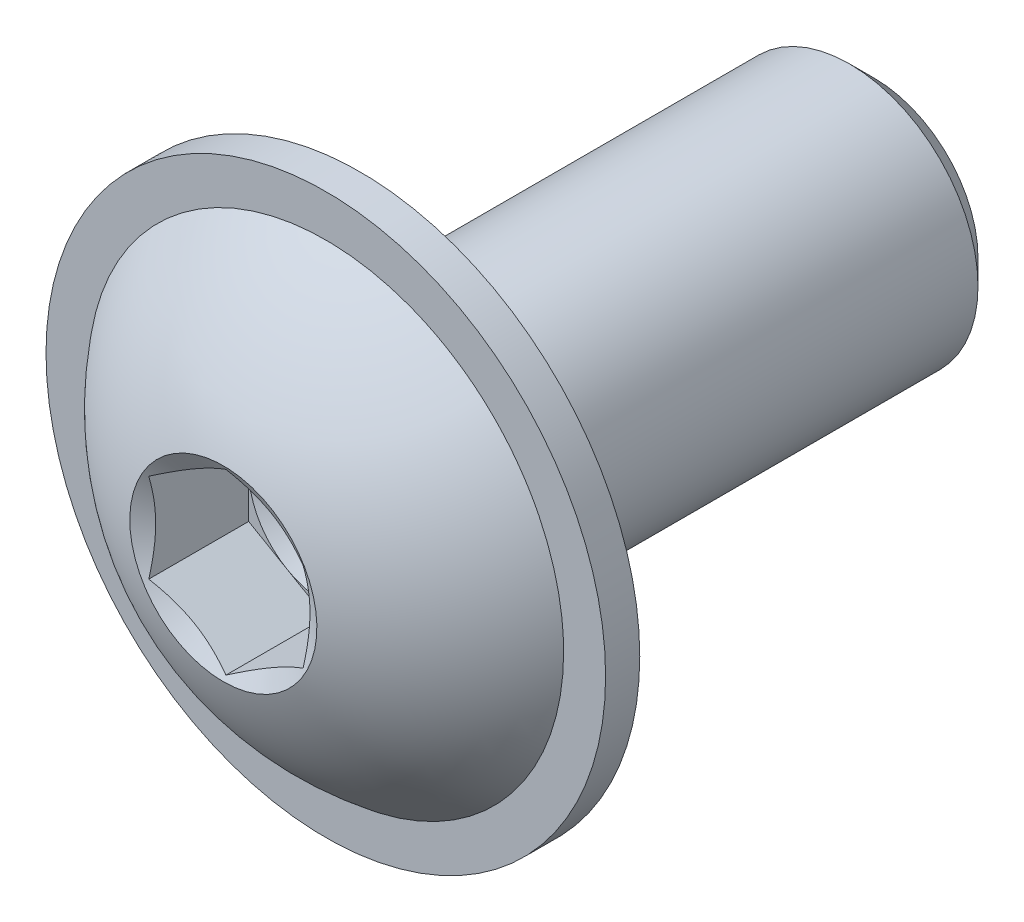
ISO-10303-21;
HEADER;
FILE_DESCRIPTION(('STEP AP214'),'2;1');
FILE_NAME('part.step','',(''),(''),'','','');
FILE_SCHEMA(('AUTOMOTIVE_DESIGN { 1 0 10303 214 1 1 1 1 }'));
ENDSEC;
DATA;
#1=APPLICATION_CONTEXT('core data for automotive mechanical design processes');
#2=APPLICATION_PROTOCOL_DEFINITION('international standard','automotive_design',2000,#1);
#3=PRODUCT_CONTEXT('',#1,'mechanical');
#4=PRODUCT('Part','Part','',(#3));
#5=PRODUCT_RELATED_PRODUCT_CATEGORY('part','',(#4));
#6=PRODUCT_DEFINITION_FORMATION('','',#4);
#7=PRODUCT_DEFINITION_CONTEXT('part definition',#1,'design');
#8=PRODUCT_DEFINITION('design','',#6,#7);
#9=PRODUCT_DEFINITION_SHAPE('','',#8);
#10=(LENGTH_UNIT() NAMED_UNIT(*) SI_UNIT(.MILLI.,.METRE.));
#11=(NAMED_UNIT(*) PLANE_ANGLE_UNIT() SI_UNIT($,.RADIAN.));
#12=(NAMED_UNIT(*) SI_UNIT($,.STERADIAN.) SOLID_ANGLE_UNIT());
#13=UNCERTAINTY_MEASURE_WITH_UNIT(LENGTH_MEASURE(1.E-05),#10,'distance_accuracy_value','');
#14=(GEOMETRIC_REPRESENTATION_CONTEXT(3) GLOBAL_UNCERTAINTY_ASSIGNED_CONTEXT((#13)) GLOBAL_UNIT_ASSIGNED_CONTEXT((#10,
#11,#12)) REPRESENTATION_CONTEXT('',''));
#15=CARTESIAN_POINT('',(0.,0.,0.));
#16=DIRECTION('',(0.,0.,1.));
#17=DIRECTION('',(1.,0.,0.));
#18=AXIS2_PLACEMENT_3D('',#15,#16,#17);
#19=CARTESIAN_POINT('',(2.38125,1.3748153285078,8.9916));
#20=DIRECTION('',(0.,0.,-1.));
#21=DIRECTION('',(-1.,0.,0.));
#22=AXIS2_PLACEMENT_3D('',#19,#20,#21);
#23=PLANE('',#22);
#24=CARTESIAN_POINT('',(0.,0.,8.99160000000165));
#25=DIRECTION('',(0.,0.,1.));
#26=DIRECTION('',(1.,0.,0.));
#27=AXIS2_PLACEMENT_3D('',#24,#25,#26);
#28=CIRCLE('',#27,2.3812499999849);
#29=CARTESIAN_POINT('',(-2.3812499999729,0.,8.99160000000083));
#30=VERTEX_POINT('',#29);
#31=CARTESIAN_POINT('',(-1.19062499640266,2.06222299484195,8.99160000000165));
#32=VERTEX_POINT('',#31);
#33=EDGE_CURVE('E20',#30,#32,#28,.F.);
#34=ORIENTED_EDGE('',*,*,#33,.T.);
#35=DIRECTION('',(0.86602540552574,0.499999996983977,0.));
#36=VECTOR('',#35,1.);
#37=CARTESIAN_POINT('',(-2.38124999759656,1.37481533544816,8.9916));
#38=LINE('',#37,#36);
#39=CARTESIAN_POINT('',(-2.38124999996403,1.37481534275786,8.99160000000374));
#40=VERTEX_POINT('',#39);
#41=EDGE_CURVE('E119',#40,#32,#38,.T.);
#42=ORIENTED_EDGE('',*,*,#41,.F.);
#43=DIRECTION('',(0.,1.,0.));
#44=VECTOR('',#43,1.);
#45=CARTESIAN_POINT('',(-2.38124999994604,1.3748153285078,8.9916));
#46=LINE('',#45,#44);
#47=EDGE_CURVE('E102',#30,#40,#46,.T.);
#48=ORIENTED_EDGE('',*,*,#47,.F.);
#49=EDGE_LOOP('',(#34,#42,#48));
#50=FACE_BOUND('',#49,.T.);
#51=ADVANCED_FACE('F16',(#50),#23,.F.);
#52=CARTESIAN_POINT('',(2.38125,1.3748153285078,8.9916));
#53=DIRECTION('',(0.,0.,-1.));
#54=DIRECTION('',(-1.,0.,0.));
#55=AXIS2_PLACEMENT_3D('',#52,#53,#54);
#56=PLANE('',#55);
#57=CARTESIAN_POINT('',(0.,0.,8.99160000000165));
#58=DIRECTION('',(0.,0.,1.));
#59=DIRECTION('',(1.,0.,0.));
#60=AXIS2_PLACEMENT_3D('',#57,#58,#59);
#61=CIRCLE('',#60,2.3812499999849);
#62=CARTESIAN_POINT('',(1.19062500001044,2.06222299277977,8.99160000000165));
#63=VERTEX_POINT('',#62);
#64=EDGE_CURVE('E136',#32,#63,#61,.F.);
#65=ORIENTED_EDGE('',*,*,#64,.T.);
#66=DIRECTION('',(0.866025403792031,-0.49999999998685,0.));
#67=VECTOR('',#66,1.);
#68=CARTESIAN_POINT('',(0.,2.74963065701559,8.9916));
#69=LINE('',#68,#67);
#70=CARTESIAN_POINT('',(3.12508553774997E-09,2.74963065881986,8.99160000000374));
#71=VERTEX_POINT('',#70);
#72=EDGE_CURVE('E121',#71,#63,#69,.T.);
#73=ORIENTED_EDGE('',*,*,#72,.F.);
#74=DIRECTION('',(0.866025403792031,0.49999999998685,0.));
#75=VECTOR('',#74,1.);
#76=CARTESIAN_POINT('',(-1.19062499999478,2.06222299278881,8.9916));
#77=LINE('',#76,#75);
#78=EDGE_CURVE('E383',#32,#71,#77,.T.);
#79=ORIENTED_EDGE('',*,*,#78,.F.);
#80=EDGE_LOOP('',(#65,#73,#79));
#81=FACE_BOUND('',#80,.T.);
#82=ADVANCED_FACE('F307',(#81),#56,.F.);
#83=CARTESIAN_POINT('',(2.38125,1.3748153285078,8.9916));
#84=DIRECTION('',(0.,0.,-1.));
#85=DIRECTION('',(-1.,0.,0.));
#86=AXIS2_PLACEMENT_3D('',#83,#84,#85);
#87=PLANE('',#86);
#88=CARTESIAN_POINT('',(0.,0.,8.99160000000165));
#89=DIRECTION('',(0.,0.,1.));
#90=DIRECTION('',(1.,0.,0.));
#91=AXIS2_PLACEMENT_3D('',#88,#89,#90);
#92=CIRCLE('',#91,2.3812499999849);
#93=CARTESIAN_POINT('',(2.3812499999729,0.,8.99160000000083));
#94=VERTEX_POINT('',#93);
#95=EDGE_CURVE('E141',#63,#94,#92,.F.);
#96=ORIENTED_EDGE('',*,*,#95,.T.);
#97=DIRECTION('',(0.,1.,0.));
#98=VECTOR('',#97,1.);
#99=CARTESIAN_POINT('',(2.38124999999975,1.3748153285078,8.9916));
#100=LINE('',#99,#98);
#101=CARTESIAN_POINT('',(2.38125000624963,1.37481532489957,8.9916));
#102=VERTEX_POINT('',#101);
#103=EDGE_CURVE('E385',#102,#94,#100,.F.);
#104=ORIENTED_EDGE('',*,*,#103,.F.);
#105=DIRECTION('',(0.866025403776847,-0.500000000013149,0.));
#106=VECTOR('',#105,1.);
#107=CARTESIAN_POINT('',(1.19062499999478,2.06222299278881,8.9916));
#108=LINE('',#107,#106);
#109=EDGE_CURVE('E390',#63,#102,#108,.T.);
#110=ORIENTED_EDGE('',*,*,#109,.F.);
#111=EDGE_LOOP('',(#96,#104,#110));
#112=FACE_BOUND('',#111,.T.);
#113=ADVANCED_FACE('F303',(#112),#87,.F.);
#114=CARTESIAN_POINT('',(2.38125,1.3748153285078,8.9916));
#115=DIRECTION('',(0.,0.,-1.));
#116=DIRECTION('',(-1.,0.,0.));
#117=AXIS2_PLACEMENT_3D('',#114,#115,#116);
#118=PLANE('',#117);
#119=CARTESIAN_POINT('',(0.,0.,8.99160000000165));
#120=DIRECTION('',(0.,0.,1.));
#121=DIRECTION('',(1.,0.,0.));
#122=AXIS2_PLACEMENT_3D('',#119,#120,#121);
#123=CIRCLE('',#122,2.3812499999849);
#124=CARTESIAN_POINT('',(1.19062499999361,-2.06222299276871,8.99160000000165));
#125=VERTEX_POINT('',#124);
#126=CARTESIAN_POINT('',(-1.19062500143657,-2.06222299193562,8.99160000000165));
#127=VERTEX_POINT('',#126);
#128=EDGE_CURVE('E130',#125,#127,#123,.F.);
#129=ORIENTED_EDGE('',*,*,#128,.T.);
#130=DIRECTION('',(-0.866025403092321,0.500000001198783,0.));
#131=VECTOR('',#130,1.);
#132=CARTESIAN_POINT('',(-1.92394320960854E-09,-2.74963065812638,8.9916));
#133=LINE('',#132,#131);
#134=CARTESIAN_POINT('',(-1.60328589399601E-09,-2.74963065757098,8.99160000001268));
#135=VERTEX_POINT('',#134);
#136=EDGE_CURVE('E404',#135,#127,#133,.T.);
#137=ORIENTED_EDGE('',*,*,#136,.F.);
#138=DIRECTION('',(-0.866025403792031,-0.49999999998685,0.));
#139=VECTOR('',#138,1.);
#140=CARTESIAN_POINT('',(1.19062500002609,-2.06222299277073,8.9916));
#141=LINE('',#140,#139);
#142=EDGE_CURVE('E111',#125,#135,#141,.T.);
#143=ORIENTED_EDGE('',*,*,#142,.F.);
#144=EDGE_LOOP('',(#129,#137,#143));
#145=FACE_BOUND('',#144,.T.);
#146=ADVANCED_FACE('F300',(#145),#118,.F.);
#147=CARTESIAN_POINT('',(2.38125,1.3748153285078,8.9916));
#148=DIRECTION('',(0.,0.,-1.));
#149=DIRECTION('',(-1.,0.,0.));
#150=AXIS2_PLACEMENT_3D('',#147,#148,#149);
#151=PLANE('',#150);
#152=CARTESIAN_POINT('',(0.,0.,8.99160000000165));
#153=DIRECTION('',(0.,0.,1.));
#154=DIRECTION('',(1.,0.,0.));
#155=AXIS2_PLACEMENT_3D('',#152,#153,#154);
#156=CIRCLE('',#155,2.3812499999849);
#157=EDGE_CURVE('E124',#127,#30,#156,.F.);
#158=ORIENTED_EDGE('',*,*,#157,.T.);
#159=DIRECTION('',(0.,1.,0.));
#160=VECTOR('',#159,1.);
#161=CARTESIAN_POINT('',(-2.38124999999975,1.3748153285078,8.9916));
#162=LINE('',#161,#160);
#163=CARTESIAN_POINT('',(-2.38125000624964,-1.37481532489956,8.9916));
#164=VERTEX_POINT('',#163);
#165=EDGE_CURVE('E98',#164,#30,#162,.T.);
#166=ORIENTED_EDGE('',*,*,#165,.F.);
#167=DIRECTION('',(-0.866025403776847,0.500000000013149,0.));
#168=VECTOR('',#167,1.);
#169=CARTESIAN_POINT('',(-1.19062500002609,-2.06222299277073,8.9916));
#170=LINE('',#169,#168);
#171=EDGE_CURVE('E110',#127,#164,#170,.T.);
#172=ORIENTED_EDGE('',*,*,#171,.F.);
#173=EDGE_LOOP('',(#158,#166,#172));
#174=FACE_BOUND('',#173,.T.);
#175=ADVANCED_FACE('F125',(#174),#151,.F.);
#176=CARTESIAN_POINT('',(0.,0.,7.9375));
#177=DIRECTION('',(0.,0.,1.));
#178=DIRECTION('',(1.,0.,0.));
#179=AXIS2_PLACEMENT_3D('',#176,#177,#178);
#180=PLANE('',#179);
#181=CARTESIAN_POINT('',(0.,0.,7.93749999991178));
#182=DIRECTION('',(0.,0.,1.));
#183=DIRECTION('',(1.,0.,0.));
#184=AXIS2_PLACEMENT_3D('',#181,#182,#183);
#185=CIRCLE('',#184,0.555495243702353);
#186=CARTESIAN_POINT('',(0.555495243702353,0.,7.93749999991178));
#187=VERTEX_POINT('',#186);
#188=EDGE_CURVE('E129',#187,#187,#185,.T.);
#189=ORIENTED_EDGE('',*,*,#188,.T.);
#190=EDGE_LOOP('',(#189));
#191=FACE_BOUND('',#190,.T.);
#192=ADVANCED_FACE('F293',(#191),#180,.T.);
#193=CARTESIAN_POINT('',(0.,0.,8.99160000000165));
#194=DIRECTION('',(0.,0.,1.));
#195=DIRECTION('',(1.,0.,0.));
#196=AXIS2_PLACEMENT_3D('',#193,#194,#195);
#197=CONICAL_SURFACE('',#196,2.3812499999849,1.04719755116542);
#198=ORIENTED_EDGE('',*,*,#188,.F.);
#199=EDGE_LOOP('',(#198));
#200=FACE_BOUND('',#199,.T.);
#201=ORIENTED_EDGE('',*,*,#33,.F.);
#202=ORIENTED_EDGE('',*,*,#157,.F.);
#203=ORIENTED_EDGE('',*,*,#128,.F.);
#204=CARTESIAN_POINT('',(0.,0.,8.99160000000165));
#205=DIRECTION('',(0.,0.,1.));
#206=DIRECTION('',(1.,0.,0.));
#207=AXIS2_PLACEMENT_3D('',#204,#205,#206);
#208=CIRCLE('',#207,2.3812499999849);
#209=EDGE_CURVE('E159',#125,#94,#208,.T.);
#210=ORIENTED_EDGE('',*,*,#209,.T.);
#211=ORIENTED_EDGE('',*,*,#95,.F.);
#212=ORIENTED_EDGE('',*,*,#64,.F.);
#213=EDGE_LOOP('',(#201,#202,#203,#210,#211,#212));
#214=FACE_BOUND('',#213,.T.);
#215=ADVANCED_FACE('F133',(#200,#214),#197,.F.);
#216=CARTESIAN_POINT('',(2.38125,1.3748153285078,8.9916));
#217=DIRECTION('',(0.,0.,-1.));
#218=DIRECTION('',(-1.,0.,0.));
#219=AXIS2_PLACEMENT_3D('',#216,#217,#218);
#220=PLANE('',#219);
#221=ORIENTED_EDGE('',*,*,#209,.F.);
#222=DIRECTION('',(0.866025403784439,0.5,0.));
#223=VECTOR('',#222,1.);
#224=CARTESIAN_POINT('',(0.,-2.74963065701559,8.99160000003804));
#225=LINE('',#224,#223);
#226=CARTESIAN_POINT('',(2.38124999542388,-1.37481534352602,8.99160000001268));
#227=VERTEX_POINT('',#226);
#228=EDGE_CURVE('E158',#125,#227,#225,.T.);
#229=ORIENTED_EDGE('',*,*,#228,.T.);
#230=DIRECTION('',(0.,1.,0.));
#231=VECTOR('',#230,1.);
#232=CARTESIAN_POINT('',(2.38124999994604,1.3748153285078,8.9916));
#233=LINE('',#232,#231);
#234=EDGE_CURVE('E155',#94,#227,#233,.F.);
#235=ORIENTED_EDGE('',*,*,#234,.F.);
#236=EDGE_LOOP('',(#221,#229,#235));
#237=FACE_BOUND('',#236,.T.);
#238=ADVANCED_FACE('F286',(#237),#220,.F.);
#239=CARTESIAN_POINT('',(0.,-2.74963065701559,8.9916));
#240=DIRECTION('',(0.5,-0.866025403784439,0.));
#241=DIRECTION('',(0.866025403784439,0.5,0.));
#242=AXIS2_PLACEMENT_3D('',#239,#240,#241);
#243=PLANE('',#242);
#244=ORIENTED_EDGE('',*,*,#228,.F.);
#245=ORIENTED_EDGE('',*,*,#142,.T.);
#246=DIRECTION('',(0.,0.,1.));
#247=VECTOR('',#246,1.);
#248=CARTESIAN_POINT('',(-9.61971821644703E-10,-2.74963065646019,8.9916));
#249=LINE('',#248,#247);
#250=CARTESIAN_POINT('',(-1.50083998651684E-09,-2.74963065622017,12.074524999481));
#251=VERTEX_POINT('',#250);
#252=EDGE_CURVE('E185',#135,#251,#249,.T.);
#253=ORIENTED_EDGE('',*,*,#252,.T.);
#254=CARTESIAN_POINT('',(-3.79007517082393E-10,-2.74963065638764,12.0745250004124));
#255=CARTESIAN_POINT('',(0.104641515921897,-2.68921584932555,12.03963438355));
#256=CARTESIAN_POINT('',(0.21018629620026,-2.62827954224289,12.0079031936952));
#257=CARTESIAN_POINT('',(0.423103293927049,-2.5053518564535,11.9525173549479));
#258=CARTESIAN_POINT('',(0.530479293266639,-2.4433582942702,11.9288822973267));
#259=CARTESIAN_POINT('',(0.743900635106127,-2.32013942506564,11.8920926261224));
#260=CARTESIAN_POINT('',(0.849913149195942,-2.25893307153389,11.8786931283456));
#261=CARTESIAN_POINT('',(1.06243674103559,-2.13623251858736,11.8626999157862));
#262=CARTESIAN_POINT('',(1.16894704685002,-2.07473876484972,11.860092954064));
#263=CARTESIAN_POINT('',(1.36795011799916,-1.95984428814957,11.8655301764705));
#264=CARTESIAN_POINT('',(1.46047274538662,-1.90642632432218,11.8722393414025));
#265=CARTESIAN_POINT('',(1.6449152455143,-1.79993839722412,11.8934991562622));
#266=CARTESIAN_POINT('',(1.73683448079363,-1.74686880199166,11.9080570613907));
#267=CARTESIAN_POINT('',(1.92165694985006,-1.64016149972944,11.9444490065436));
#268=CARTESIAN_POINT('',(2.01453680365633,-1.58653729113215,11.966437237652));
#269=CARTESIAN_POINT('',(2.19891160910941,-1.48008844757212,12.0163412266196));
#270=CARTESIAN_POINT('',(2.2904089209875,-1.42726244992924,12.0442452665574));
#271=CARTESIAN_POINT('',(2.38124989307,-1.37481539024386,12.0745249642848));
#272=B_SPLINE_CURVE_WITH_KNOTS('',3,(#254,#255,#256,#257,#258,#259,#260,#261,#262,#263,#264,
#265,#266,#267,#268,#269,#270,#271),.UNSPECIFIED.,.F.,.F.,(4,2,2,2,2,2,2,2,4),(0.,
0.377447188754475,0.755801388356325,1.12479249374662,1.49333055874494,1.81416454774712,
2.13529561831788,2.46354783626387,2.79115583386876),.UNSPECIFIED.);
#273=CARTESIAN_POINT('',(2.381249946535,-1.37481537516564,12.0745249866646));
#274=VERTEX_POINT('',#273);
#275=EDGE_CURVE('E188',#251,#274,#272,.T.);
#276=ORIENTED_EDGE('',*,*,#275,.T.);
#277=DIRECTION('',(0.,0.,-1.));
#278=VECTOR('',#277,1.);
#279=CARTESIAN_POINT('',(2.38125,-1.37481536008743,8.9916));
#280=LINE('',#279,#278);
#281=EDGE_CURVE('E162',#274,#227,#280,.T.);
#282=ORIENTED_EDGE('',*,*,#281,.T.);
#283=EDGE_LOOP('',(#244,#245,#253,#276,#282));
#284=FACE_BOUND('',#283,.T.);
#285=ADVANCED_FACE('F281',(#284),#243,.F.);
#286=CARTESIAN_POINT('',(2.38125,-1.37481532850779,8.9916));
#287=DIRECTION('',(1.,0.,0.));
#288=DIRECTION('',(0.,0.,-1.));
#289=AXIS2_PLACEMENT_3D('',#286,#287,#288);
#290=PLANE('',#289);
#291=ORIENTED_EDGE('',*,*,#103,.T.);
#292=ORIENTED_EDGE('',*,*,#234,.T.);
#293=ORIENTED_EDGE('',*,*,#281,.F.);
#294=CARTESIAN_POINT('',(2.38124995321313,-1.37481537870666,12.0745250450507));
#295=CARTESIAN_POINT('',(2.38124998319625,-1.25398576486325,12.0396344080975));
#296=CARTESIAN_POINT('',(2.38124999549631,-1.13211314866552,12.0079032088097));
#297=CARTESIAN_POINT('',(2.3812500045145,-0.886257771158485,11.952517360886));
#298=CARTESIAN_POINT('',(2.38125000119513,-0.762270642894913,11.9288823035267));
#299=CARTESIAN_POINT('',(2.38124999883444,-0.515832897718955,11.8920926308264));
#300=CARTESIAN_POINT('',(2.3812499996893,-0.393420187782588,11.878693131301));
#301=CARTESIAN_POINT('',(2.38125000031031,-0.148019075787991,11.8626999163773));
#302=CARTESIAN_POINT('',(2.38125000007781,-0.0250315650836614,11.8600929540479));
#303=CARTESIAN_POINT('',(2.38124999993225,0.204757393336929,11.8655301756767));
#304=CARTESIAN_POINT('',(2.38124999998174,0.311593322785942,11.8722393403096));
#305=CARTESIAN_POINT('',(2.38125000001827,0.524569180506466,11.8934991548929));
#306=CARTESIAN_POINT('',(2.38125000000527,0.630708372702024,11.9080570600395));
#307=CARTESIAN_POINT('',(2.38124999999461,0.844122981054427,11.9444490055296));
#308=CARTESIAN_POINT('',(2.38124999999731,0.951371400341314,11.9664372369865));
#309=CARTESIAN_POINT('',(2.38125000000268,1.16426909168079,12.0163412269063));
#310=CARTESIAN_POINT('',(2.38125000000536,1.26992108909261,12.0442452674526));
#311=CARTESIAN_POINT('',(2.38125,1.37481521055776,12.0745249658789));
#312=B_SPLINE_CURVE_WITH_KNOTS('',3,(#294,#295,#296,#297,#298,#299,#300,#301,#302,#303,#304,
#305,#306,#307,#308,#309,#310,#311),.UNSPECIFIED.,.F.,.F.,(4,2,2,2,2,2,2,2,4),(0.,
0.377447200743821,0.755801411540574,1.12479252620264,1.49333060080488,1.81416459513079,
2.13529567082958,2.46354789512518,2.79115589935076),.UNSPECIFIED.);
#313=CARTESIAN_POINT('',(2.3812500093747,1.37481526412029,12.0745249860285));
#314=VERTEX_POINT('',#313);
#315=EDGE_CURVE('E267',#274,#314,#312,.T.);
#316=ORIENTED_EDGE('',*,*,#315,.T.);
#317=DIRECTION('',(0.,0.,1.));
#318=VECTOR('',#317,1.);
#319=CARTESIAN_POINT('',(2.38125001874941,1.37481531768282,8.9916));
#320=LINE('',#319,#318);
#321=EDGE_CURVE('E166',#314,#102,#320,.F.);
#322=ORIENTED_EDGE('',*,*,#321,.T.);
#323=EDGE_LOOP('',(#291,#292,#293,#316,#322));
#324=FACE_BOUND('',#323,.T.);
#325=ADVANCED_FACE('F278',(#324),#290,.F.);
#326=CARTESIAN_POINT('',(2.38125,1.3748153285078,8.9916));
#327=DIRECTION('',(0.5,0.866025403784439,0.));
#328=DIRECTION('',(-0.866025403784439,0.5,0.));
#329=AXIS2_PLACEMENT_3D('',#326,#327,#328);
#330=PLANE('',#329);
#331=ORIENTED_EDGE('',*,*,#72,.T.);
#332=ORIENTED_EDGE('',*,*,#109,.T.);
#333=ORIENTED_EDGE('',*,*,#321,.F.);
#334=CARTESIAN_POINT('',(2.38125001362405,1.37481526807826,12.0745250418594));
#335=CARTESIAN_POINT('',(2.27660851312276,1.43523010024625,12.0396344056054));
#336=CARTESIAN_POINT('',(2.17106373755059,1.49616641865316,12.0079032067365));
#337=CARTESIAN_POINT('',(1.95814673961115,1.61909411486023,11.9525173594031));
#338=CARTESIAN_POINT('',(1.85077073533232,1.68108767610589,11.9288823022154));
#339=CARTESIAN_POINT('',(1.6373493867808,1.80430654649076,11.8920926299368));
#340=CARTESIAN_POINT('',(1.53133687086268,1.86551290205396,11.8786931306537));
#341=CARTESIAN_POINT('',(1.31881327452385,1.98821345830703,11.8626999161607));
#342=CARTESIAN_POINT('',(1.21230296603891,2.04970721332107,11.8600929540192));
#343=CARTESIAN_POINT('',(1.01329988046387,2.16460169818385,11.8655301762441));
#344=CARTESIAN_POINT('',(0.92077724132001,2.21801966885529,11.8722393422348));
#345=CARTESIAN_POINT('',(0.736334717879398,2.32450760945479,11.8934991611826));
#346=CARTESIAN_POINT('',(0.644415471043517,2.37757721134458,11.9080570693401));
#347=CARTESIAN_POINT('',(0.459592978344195,2.48428452724486,11.9444490222531));
#348=CARTESIAN_POINT('',(0.366713112466121,2.53790874281489,11.9664372581729));
#349=CARTESIAN_POINT('',(0.182338283217444,2.64435760011944,12.0163412579417));
#350=CARTESIAN_POINT('',(0.0908409596151174,2.69718360453439,12.044245303868));
#351=CARTESIAN_POINT('',(-2.40304767990144E-08,2.74963067088959,12.0745250079383));
#352=B_SPLINE_CURVE_WITH_KNOTS('',3,(#334,#335,#336,#337,#338,#339,#340,#341,#342,#343,#344,
#345,#346,#347,#348,#349,#350,#351),.UNSPECIFIED.,.F.,.F.,(4,2,2,2,2,2,2,2,4),(0.,
0.377447200102827,0.755801410287489,1.12479252411618,1.4933305978666,1.81416462770198,
2.13529573904733,2.4635480008114,2.79115604220971),.UNSPECIFIED.);
#353=CARTESIAN_POINT('',(1.40628579068182E-08,2.74963087079161,12.0745251233434));
#354=VERTEX_POINT('',#353);
#355=EDGE_CURVE('E261',#314,#354,#352,.T.);
#356=ORIENTED_EDGE('',*,*,#355,.T.);
#357=DIRECTION('',(0.,0.,1.));
#358=VECTOR('',#357,1.);
#359=CARTESIAN_POINT('',(9.37525696075919E-09,2.7496306624284,8.9916));
#360=LINE('',#359,#358);
#361=EDGE_CURVE('E172',#354,#71,#360,.F.);
#362=ORIENTED_EDGE('',*,*,#361,.T.);
#363=EDGE_LOOP('',(#331,#332,#333,#356,#362));
#364=FACE_BOUND('',#363,.T.);
#365=ADVANCED_FACE('F251',(#364),#330,.F.);
#366=CARTESIAN_POINT('',(0.,2.74963065701559,8.9916));
#367=DIRECTION('',(-0.5,0.866025403784439,0.));
#368=DIRECTION('',(-0.866025403784439,-0.5,0.));
#369=AXIS2_PLACEMENT_3D('',#366,#367,#368);
#370=PLANE('',#369);
#371=ORIENTED_EDGE('',*,*,#41,.T.);
#372=ORIENTED_EDGE('',*,*,#78,.T.);
#373=ORIENTED_EDGE('',*,*,#361,.F.);
#374=CARTESIAN_POINT('',(4.56656724527235E-08,2.74963068338068,12.0745250151501));
#375=CARTESIAN_POINT('',(-0.104641471182434,2.68921587546001,12.0396343973436));
#376=CARTESIAN_POINT('',(-0.210186252112902,2.62827956777825,12.0079032062954));
#377=CARTESIAN_POINT('',(-0.423103251309495,2.50535188097705,11.9525173649031));
#378=CARTESIAN_POINT('',(-0.530479251467519,2.44335831838131,11.9288823058319));
#379=CARTESIAN_POINT('',(-0.743900594924477,2.32013944828562,11.8920926317835));
#380=CARTESIAN_POINT('',(-0.849913109811025,2.2589330942784,11.8786931326069));
#381=CARTESIAN_POINT('',(-1.06243670334596,2.13623254034186,11.8626999173292));
#382=CARTESIAN_POINT('',(-1.16894701005874,2.07473878608977,11.8600929542872));
#383=CARTESIAN_POINT('',(-1.36795008508729,1.95984430715247,11.8655301744992));
#384=CARTESIAN_POINT('',(-1.46047271544026,1.90642634161205,11.8722393387189));
#385=CARTESIAN_POINT('',(-1.64491522150978,1.79993841108281,11.8934991527261));
#386=CARTESIAN_POINT('',(-1.73683445976536,1.74686881413224,11.9080570577157));
#387=CARTESIAN_POINT('',(-1.92165693487569,1.640161508375,11.9444490031184));
#388=CARTESIAN_POINT('',(-2.01453679175741,1.58653729800204,11.9664372346335));
#389=CARTESIAN_POINT('',(-2.19891160326523,1.48008845094622,12.016341224836));
#390=CARTESIAN_POINT('',(-2.29040891812293,1.427262451583,12.0442452656001));
#391=CARTESIAN_POINT('',(-2.38124989313815,1.37481539020451,12.0745249643076));
#392=B_SPLINE_CURVE_WITH_KNOTS('',3,(#374,#375,#376,#377,#378,#379,#380,#381,#382,#383,#384,
#385,#386,#387,#388,#389,#390,#391),.UNSPECIFIED.,.F.,.F.,(4,2,2,2,2,2,2,2,4),(0.,
0.377447192173661,0.755801395300756,1.12479250391227,1.49333057209158,1.81416457117838,
2.13529565187614,2.46354788048295,2.79115588867554),.UNSPECIFIED.);
#393=CARTESIAN_POINT('',(-2.38124994656908,1.37481537514736,12.0745249866764));
#394=VERTEX_POINT('',#393);
#395=EDGE_CURVE('E255',#354,#394,#392,.T.);
#396=ORIENTED_EDGE('',*,*,#395,.T.);
#397=DIRECTION('',(0.,0.,1.));
#398=VECTOR('',#397,1.);
#399=CARTESIAN_POINT('',(-2.38125,1.37481536009022,8.9916));
#400=LINE('',#399,#398);
#401=EDGE_CURVE('E178',#394,#40,#400,.F.);
#402=ORIENTED_EDGE('',*,*,#401,.T.);
#403=EDGE_LOOP('',(#371,#372,#373,#396,#402));
#404=FACE_BOUND('',#403,.T.);
#405=ADVANCED_FACE('F247',(#404),#370,.F.);
#406=CARTESIAN_POINT('',(-2.38125,1.37481532850779,8.9916));
#407=DIRECTION('',(-1.,0.,0.));
#408=DIRECTION('',(0.,-1.,0.));
#409=AXIS2_PLACEMENT_3D('',#406,#407,#408);
#410=PLANE('',#409);
#411=ORIENTED_EDGE('',*,*,#165,.T.);
#412=ORIENTED_EDGE('',*,*,#47,.T.);
#413=ORIENTED_EDGE('',*,*,#401,.F.);
#414=CARTESIAN_POINT('',(-2.38124995325506,1.37481537873606,12.0745250450318));
#415=CARTESIAN_POINT('',(-2.38124998321131,1.2539857648904,12.039634408095));
#416=CARTESIAN_POINT('',(-2.38124999550035,1.13211314869296,12.007903208814));
#417=CARTESIAN_POINT('',(-2.38125000451046,0.886257771188454,11.9525173608947));
#418=CARTESIAN_POINT('',(-2.38125000119406,0.762270642927128,11.9288823035332));
#419=CARTESIAN_POINT('',(-2.38124999883549,0.515832897754642,11.8920926308302));
#420=CARTESIAN_POINT('',(-2.38124999968958,0.393420187819513,11.8786931313044));
#421=CARTESIAN_POINT('',(-2.38125000031004,0.148019075827584,11.8626999163789));
#422=CARTESIAN_POINT('',(-2.38125000007775,0.0250315651246847,11.8600929540483));
#423=CARTESIAN_POINT('',(-2.38124999993231,-0.204757393299966,11.8655301756747));
#424=CARTESIAN_POINT('',(-2.38124999998175,-0.311593322754437,11.8722393403071));
#425=CARTESIAN_POINT('',(-2.38125000001826,-0.524569180485911,11.8934991548902));
#426=CARTESIAN_POINT('',(-2.38125000000526,-0.630708372686961,11.9080570600372));
#427=CARTESIAN_POINT('',(-2.38124999999461,-0.844122981050237,11.9444490055287));
#428=CARTESIAN_POINT('',(-2.38124999999731,-0.951371400342505,11.9664372369866));
#429=CARTESIAN_POINT('',(-2.38125000000268,-1.16426909169247,12.0163412269092));
#430=CARTESIAN_POINT('',(-2.38125000000536,-1.26992108910941,12.044245267457));
#431=CARTESIAN_POINT('',(-2.38125,-1.37481521057959,12.0745249658852));
#432=B_SPLINE_CURVE_WITH_KNOTS('',3,(#414,#415,#416,#417,#418,#419,#420,#421,#422,#423,#424,
#425,#426,#427,#428,#429,#430,#431),.UNSPECIFIED.,.F.,.F.,(4,2,2,2,2,2,2,2,4),(0.,
0.377447200738,0.75580141152979,1.12479252618812,1.49333060078626,1.81416459512833,
2.13529567084355,2.46354789515559,2.7911558993972),.UNSPECIFIED.);
#433=CARTESIAN_POINT('',(-2.38125000937472,-1.37481526413119,12.0745249860316));
#434=VERTEX_POINT('',#433);
#435=EDGE_CURVE('E235',#394,#434,#432,.T.);
#436=ORIENTED_EDGE('',*,*,#435,.T.);
#437=DIRECTION('',(0.,0.,1.));
#438=VECTOR('',#437,1.);
#439=CARTESIAN_POINT('',(-2.38125001874944,-1.3748153176828,8.9916));
#440=LINE('',#439,#438);
#441=EDGE_CURVE('E105',#434,#164,#440,.F.);
#442=ORIENTED_EDGE('',*,*,#441,.T.);
#443=EDGE_LOOP('',(#411,#412,#413,#436,#442));
#444=FACE_BOUND('',#443,.T.);
#445=ADVANCED_FACE('F100',(#444),#410,.F.);
#446=CARTESIAN_POINT('',(-2.38125,-1.37481532850779,8.9916));
#447=DIRECTION('',(-0.5,-0.866025403784439,0.));
#448=DIRECTION('',(0.866025403784439,-0.5,0.));
#449=AXIS2_PLACEMENT_3D('',#446,#447,#448);
#450=PLANE('',#449);
#451=ORIENTED_EDGE('',*,*,#136,.T.);
#452=ORIENTED_EDGE('',*,*,#171,.T.);
#453=ORIENTED_EDGE('',*,*,#441,.F.);
#454=CARTESIAN_POINT('',(-2.38125001360989,-1.37481526809291,12.0745250418501));
#455=CARTESIAN_POINT('',(-2.2766085131152,-1.43523010025294,12.0396344056016));
#456=CARTESIAN_POINT('',(-2.17106373755108,-1.4961664186535,12.0079032067364));
#457=CARTESIAN_POINT('',(-1.95814673963025,-1.61909411484857,11.9525173594083));
#458=CARTESIAN_POINT('',(-1.85077073536201,-1.68108767608858,11.928882302222));
#459=CARTESIAN_POINT('',(-1.63734938681325,-1.80430654647218,11.892092629941));
#460=CARTESIAN_POINT('',(-1.53133687088708,-1.86551290203991,11.8786931306559));
#461=CARTESIAN_POINT('',(-1.31881327453074,-1.988213458303,11.8626999161608));
#462=CARTESIAN_POINT('',(-1.21230296603634,-2.04970721332254,11.8600929540193));
#463=CARTESIAN_POINT('',(-1.01329988261487,-2.16460169694198,11.8655301761853));
#464=CARTESIAN_POINT('',(-0.920777245629387,-2.21801966636727,11.8722393419213));
#465=CARTESIAN_POINT('',(-0.736334726469693,-2.32450760449517,11.8934991600089));
#466=CARTESIAN_POINT('',(-0.644415481756262,-2.37757720515957,11.9080570675601));
#467=CARTESIAN_POINT('',(-0.459592993351009,-2.48428451858067,11.944449018961));
#468=CARTESIAN_POINT('',(-0.366713129642448,-2.53790873289813,11.9664372539641));
#469=CARTESIAN_POINT('',(-0.182338304653876,-2.64435758774311,12.0163412517001));
#470=CARTESIAN_POINT('',(-0.0908409831424271,-2.69718359095089,12.0442452965114));
#471=CARTESIAN_POINT('',(-1.55838934676998E-09,-2.74963065611585,12.0745249994087));
#472=B_SPLINE_CURVE_WITH_KNOTS('',3,(#454,#455,#456,#457,#458,#459,#460,#461,#462,#463,#464,
#465,#466,#467,#468,#469,#470,#471),.UNSPECIFIED.,.F.,.F.,(4,2,2,2,2,2,2,2,4),(0.,
0.377447200070564,0.755801410219197,1.12479252407632,1.49333059785793,1.8141646202059,
2.13529572403616,2.46354797789476,2.79115601144776),.UNSPECIFIED.);
#473=EDGE_CURVE('E226',#434,#251,#472,.T.);
#474=ORIENTED_EDGE('',*,*,#473,.T.);
#475=ORIENTED_EDGE('',*,*,#252,.F.);
#476=EDGE_LOOP('',(#451,#452,#453,#474,#475));
#477=FACE_BOUND('',#476,.T.);
#478=ADVANCED_FACE('F241',(#477),#450,.F.);
#479=CARTESIAN_POINT('',(0.,0.,12.1538999999302));
#480=DIRECTION('',(0.,0.,1.));
#481=DIRECTION('',(0.,-1.,0.));
#482=AXIS2_PLACEMENT_3D('',#479,#480,#481);
#483=CONICAL_SURFACE('',#482,2.88711218991011,1.04719755132327);
#484=ORIENTED_EDGE('',*,*,#395,.F.);
#485=ORIENTED_EDGE('',*,*,#355,.F.);
#486=ORIENTED_EDGE('',*,*,#315,.F.);
#487=ORIENTED_EDGE('',*,*,#275,.F.);
#488=ORIENTED_EDGE('',*,*,#473,.F.);
#489=ORIENTED_EDGE('',*,*,#435,.F.);
#490=EDGE_LOOP('',(#484,#485,#486,#487,#488,#489));
#491=FACE_BOUND('',#490,.T.);
#492=CARTESIAN_POINT('',(0.,0.,12.1538999999302));
#493=DIRECTION('',(0.,0.,1.));
#494=DIRECTION('',(0.,-1.,0.));
#495=AXIS2_PLACEMENT_3D('',#492,#493,#494);
#496=CIRCLE('',#495,2.88711218991011);
#497=CARTESIAN_POINT('',(0.,-2.88711218991011,12.1538999999302));
#498=VERTEX_POINT('',#497);
#499=EDGE_CURVE('E221',#498,#498,#496,.F.);
#500=ORIENTED_EDGE('',*,*,#499,.F.);
#501=EDGE_LOOP('',(#500));
#502=FACE_BOUND('',#501,.T.);
#503=ADVANCED_FACE('F206',(#491,#502),#483,.F.);
#504=CARTESIAN_POINT('',(0.,0.,3.37087295431728));
#505=DIRECTION('',(0.551818859155867,0.62383863364426,0.553463012181285));
#506=DIRECTION('',(-0.767438064442694,0.639595230310225,0.0442352643132332));
#507=AXIS2_PLACEMENT_3D('',#504,#505,#506);
#508=SPHERICAL_SURFACE('',#507,9.2453761893213);
#509=ORIENTED_EDGE('',*,*,#499,.T.);
#510=EDGE_LOOP('',(#509));
#511=FACE_BOUND('',#510,.T.);
#512=CARTESIAN_POINT('',(7.3406,0.,8.9916));
#513=CARTESIAN_POINT('',(7.34059886225395,-0.206100815293459,8.9916));
#514=CARTESIAN_POINT('',(7.33191274875507,-0.412238992436167,8.9916));
#515=CARTESIAN_POINT('',(7.29722206890498,-0.8230941356278,8.9916));
#516=CARTESIAN_POINT('',(7.27121238960384,-1.02781066405589,8.9916));
#517=CARTESIAN_POINT('',(7.20200028179047,-1.43465730530384,8.9916));
#518=CARTESIAN_POINT('',(7.1587705617795,-1.63678278424643,8.9916));
#519=CARTESIAN_POINT('',(7.05538407823166,-2.03683142262157,8.9916));
#520=CARTESIAN_POINT('',(6.9952135782427,-2.23475103107213,8.9916));
#521=CARTESIAN_POINT('',(6.85850724305584,-2.62447246385854,8.9916));
#522=CARTESIAN_POINT('',(6.78199976295545,-2.81628423467688,8.9916));
#523=CARTESIAN_POINT('',(6.61306361656725,-3.19286799408665,8.9916));
#524=CARTESIAN_POINT('',(6.52062775723141,-3.37763675591034,8.9916));
#525=CARTESIAN_POINT('',(6.32051242716433,-3.73873536791462,8.9916));
#526=CARTESIAN_POINT('',(6.21283238531384,-3.91506490159043,8.9916));
#527=CARTESIAN_POINT('',(5.98304918947838,-4.2579459306107,8.9916));
#528=CARTESIAN_POINT('',(5.86095256728218,-4.4245018033388,8.9916));
#529=CARTESIAN_POINT('',(5.60308158651423,-4.74684239357113,8.9916));
#530=CARTESIAN_POINT('',(5.4672984434095,-4.90262008367231,8.9916));
#531=CARTESIAN_POINT('',(5.18322363786281,-5.20203294726828,8.9916));
#532=CARTESIAN_POINT('',(5.03494416173962,-5.34567968316912,8.9916));
#533=CARTESIAN_POINT('',(4.72674706259727,-5.62004044317735,8.9916));
#534=CARTESIAN_POINT('',(4.5668241980223,-5.75074857939825,8.9916));
#535=CARTESIAN_POINT('',(4.23649823891953,-5.99825765574892,8.9916));
#536=CARTESIAN_POINT('',(4.06609272563076,-6.11505536780305,8.9916));
#537=CARTESIAN_POINT('',(3.716074859494,-6.33386029253159,8.9916));
#538=CARTESIAN_POINT('',(3.53646398717018,-6.43586987358221,8.9916));
#539=CARTESIAN_POINT('',(3.16928469193966,-6.62439689615265,8.9916));
#540=CARTESIAN_POINT('',(2.98171616120048,-6.71091412765607,8.9916));
#541=CARTESIAN_POINT('',(2.59996180826134,-6.86783782107792,8.9916));
#542=CARTESIAN_POINT('',(2.40577613967145,-6.9382446566904,8.9916));
#543=CARTESIAN_POINT('',(2.01216161660996,-7.06245030540446,8.9916));
#544=CARTESIAN_POINT('',(1.81273270216931,-7.11624892846172,8.9916));
#545=CARTESIAN_POINT('',(1.41009461176485,-7.2068449253981,8.9916));
#546=CARTESIAN_POINT('',(1.20688624995532,-7.24364591771018,8.9916));
#547=CARTESIAN_POINT('',(0.798004996258552,-7.30001402535117,8.9916));
#548=CARTESIAN_POINT('',(0.592331092958812,-7.31957380442388,8.9916));
#549=CARTESIAN_POINT('',(0.180066595825631,-7.3412936750386,8.9916));
#550=CARTESIAN_POINT('',(-0.0265239980078109,-7.34345376658061,8.9916));
#551=CARTESIAN_POINT('',(-0.439064712607945,-7.33036170864937,8.9916));
#552=CARTESIAN_POINT('',(-0.645015068316528,-7.31511696109565,8.99159999999999));
#553=CARTESIAN_POINT('',(-1.05494374391551,-7.26733048364529,8.99159999999999));
#554=CARTESIAN_POINT('',(-1.25892163437266,-7.23478506979817,8.9916));
#555=CARTESIAN_POINT('',(-1.66340829645731,-7.1526268314223,8.9916));
#556=CARTESIAN_POINT('',(-1.86391710775259,-7.1030142021872,8.9916));
#557=CARTESIAN_POINT('',(-2.26004716934918,-6.98707281249127,8.9916));
#558=CARTESIAN_POINT('',(-2.45566830615741,-6.92074366426425,8.99160000000001));
#559=CARTESIAN_POINT('',(-2.84062477811841,-6.77184239569812,8.99159999999999));
#560=CARTESIAN_POINT('',(-3.0299601984388,-6.6892704955435,8.99159999999996));
#561=CARTESIAN_POINT('',(-3.40103175544636,-6.50845566960167,8.99159999999996));
#562=CARTESIAN_POINT('',(-3.58276666866718,-6.41021023298037,8.99159999999999));
#563=CARTESIAN_POINT('',(-3.93727147634303,-6.19878099312022,8.99160000000001));
#564=CARTESIAN_POINT('',(-4.11004343697259,-6.08560065424273,8.99159999999999));
#565=CARTESIAN_POINT('',(-4.44536338142498,-5.84514314572096,8.9916));
#566=CARTESIAN_POINT('',(-4.60791595910561,-5.71787238213516,8.99160000000002));
#567=CARTESIAN_POINT('',(-4.92187954775177,-5.44996675875716,8.99159999999998));
#568=CARTESIAN_POINT('',(-5.07327965480339,-5.30931912006594,8.99159999999992));
#569=CARTESIAN_POINT('',(-5.363593656542,-5.01585927745019,8.99159999999992));
#570=CARTESIAN_POINT('',(-5.50251554871342,-4.86305498507772,8.99159999999998));
#571=CARTESIAN_POINT('',(-5.76705558385857,-4.5462170344535,8.99160000000002));
#572=CARTESIAN_POINT('',(-5.89266769116509,-4.38217833671035,8.9916));
#573=CARTESIAN_POINT('',(-6.12961834742465,-4.04410624466868,8.9916));
#574=CARTESIAN_POINT('',(-6.24095743107794,-3.87007322513428,8.99160000000002));
#575=CARTESIAN_POINT('',(-6.44852864102044,-3.51332549604454,8.99159999999998));
#576=CARTESIAN_POINT('',(-6.5447675814787,-3.3306147512175,8.99159999999991));
#577=CARTESIAN_POINT('',(-6.7216678683125,-2.9574154669585,8.99159999999991));
#578=CARTESIAN_POINT('',(-6.80230206170791,-2.76691405663927,8.99159999999998));
#579=CARTESIAN_POINT('',(-6.94715210393352,-2.37994358836884,8.99160000000002));
#580=CARTESIAN_POINT('',(-7.01138124004569,-2.18347950512642,8.9916));
#581=CARTESIAN_POINT('',(-7.12296040622458,-1.78615772742284,8.9916));
#582=CARTESIAN_POINT('',(-7.1703370897931,-1.58530750889409,8.99160000000002));
#583=CARTESIAN_POINT('',(-7.24800713665464,-1.18037201307283,8.99159999999998));
#584=CARTESIAN_POINT('',(-7.2783055386089,-0.976287708231787,8.99159999999993));
#585=CARTESIAN_POINT('',(-7.31349796014939,-0.643238967658099,8.99159999999995));
#586=CARTESIAN_POINT('',(-7.32365805201081,-0.514808058523822,8.99159999999999));
#587=CARTESIAN_POINT('',(-7.33720942745167,-0.25758963026066,8.99160000000001));
#588=CARTESIAN_POINT('',(-7.34060071103111,-0.128802111131775,8.9916));
#589=CARTESIAN_POINT('',(-7.34059886225396,0.206100815293462,8.99159999999999));
#590=CARTESIAN_POINT('',(-7.33191274875508,0.412238992436172,8.9916));
#591=CARTESIAN_POINT('',(-7.29722206890498,0.823094135627811,8.9916));
#592=CARTESIAN_POINT('',(-7.27121238960384,1.0278106640559,8.9916));
#593=CARTESIAN_POINT('',(-7.20200028179047,1.43465730530386,8.9916));
#594=CARTESIAN_POINT('',(-7.15877056177949,1.63678278424645,8.9916));
#595=CARTESIAN_POINT('',(-7.05538407823166,2.03683142262159,8.9916));
#596=CARTESIAN_POINT('',(-6.9952135782427,2.23475103107215,8.9916));
#597=CARTESIAN_POINT('',(-6.85850724305583,2.62447246385857,8.9916));
#598=CARTESIAN_POINT('',(-6.78199976295544,2.81628423467691,8.9916));
#599=CARTESIAN_POINT('',(-6.61306361656724,3.19286799408668,8.9916));
#600=CARTESIAN_POINT('',(-6.52062775723139,3.37763675591037,8.9916));
#601=CARTESIAN_POINT('',(-6.32051242716431,3.73873536791466,8.9916));
#602=CARTESIAN_POINT('',(-6.21283238531382,3.91506490159047,8.9916));
#603=CARTESIAN_POINT('',(-5.98304918947835,4.25794593061074,8.9916));
#604=CARTESIAN_POINT('',(-5.86095256728215,4.42450180333884,8.9916));
#605=CARTESIAN_POINT('',(-5.6030815865142,4.74684239357117,8.9916));
#606=CARTESIAN_POINT('',(-5.46729844340947,4.90262008367234,8.9916));
#607=CARTESIAN_POINT('',(-5.18322363786277,5.20203294726832,8.9916));
#608=CARTESIAN_POINT('',(-5.03494416173959,5.34567968316915,8.9916));
#609=CARTESIAN_POINT('',(-4.72674706259723,5.62004044317738,8.9916));
#610=CARTESIAN_POINT('',(-4.56682419802227,5.75074857939828,8.9916));
#611=CARTESIAN_POINT('',(-4.23649823891949,5.99825765574895,8.99159999999999));
#612=CARTESIAN_POINT('',(-4.06609272563072,6.11505536780308,8.99159999999999));
#613=CARTESIAN_POINT('',(-3.71607485949397,6.33386029253162,8.99159999999999));
#614=CARTESIAN_POINT('',(-3.53646398717014,6.43586987358223,8.99159999999999));
#615=CARTESIAN_POINT('',(-3.16928469193961,6.62439689615266,8.9916));
#616=CARTESIAN_POINT('',(-2.98171616120044,6.71091412765609,8.9916));
#617=CARTESIAN_POINT('',(-2.59996180826129,6.86783782107794,8.9916));
#618=CARTESIAN_POINT('',(-2.4057761396714,6.93824465669041,8.9916));
#619=CARTESIAN_POINT('',(-2.01216161660991,7.06245030540448,8.9916));
#620=CARTESIAN_POINT('',(-1.81273270216926,7.11624892846173,8.99159999999999));
#621=CARTESIAN_POINT('',(-1.4100946117648,7.20684492539811,8.99159999999999));
#622=CARTESIAN_POINT('',(-1.20688624995526,7.24364591771018,8.9916));
#623=CARTESIAN_POINT('',(-0.798004996258495,7.30001402535117,8.9916));
#624=CARTESIAN_POINT('',(-0.592331092958755,7.31957380442388,8.9916));
#625=CARTESIAN_POINT('',(-0.180066595825573,7.34129367503861,8.9916));
#626=CARTESIAN_POINT('',(0.0265239980078688,7.34345376658062,8.9916));
#627=CARTESIAN_POINT('',(0.439064712608003,7.33036170864937,8.9916));
#628=CARTESIAN_POINT('',(0.645015068316586,7.31511696109564,8.99159999999999));
#629=CARTESIAN_POINT('',(1.05494374391557,7.26733048364528,8.99159999999999));
#630=CARTESIAN_POINT('',(1.25892163437272,7.23478506979815,8.9916));
#631=CARTESIAN_POINT('',(1.66340829645737,7.15262683142229,8.9916));
#632=CARTESIAN_POINT('',(1.86391710775264,7.10301420218719,8.9916));
#633=CARTESIAN_POINT('',(2.26004716934923,6.98707281249126,8.9916));
#634=CARTESIAN_POINT('',(2.45566830615747,6.92074366426423,8.9916));
#635=CARTESIAN_POINT('',(2.84062477811846,6.7718423956981,8.9916));
#636=CARTESIAN_POINT('',(3.02996019843885,6.68927049554345,8.9916));
#637=CARTESIAN_POINT('',(3.40103175544641,6.50845566960162,8.9916));
#638=CARTESIAN_POINT('',(3.58276666866724,6.41021023298033,8.9916));
#639=CARTESIAN_POINT('',(3.93727147634309,6.19878099312019,8.9916));
#640=CARTESIAN_POINT('',(4.11004343697264,6.0856006542427,8.9916));
#641=CARTESIAN_POINT('',(4.44536338142504,5.84514314572092,8.9916));
#642=CARTESIAN_POINT('',(4.60791595910568,5.71787238213513,8.9916));
#643=CARTESIAN_POINT('',(4.92187954775182,5.4499667587571,8.9916));
#644=CARTESIAN_POINT('',(5.07327965480342,5.30931912006585,8.99159999999999));
#645=CARTESIAN_POINT('',(5.36359365654202,5.01585927745009,8.99159999999999));
#646=CARTESIAN_POINT('',(5.50251554871347,4.86305498507764,8.9916));
#647=CARTESIAN_POINT('',(5.76705558385863,4.54621703445343,8.9916));
#648=CARTESIAN_POINT('',(5.89266769116514,4.38217833671027,8.9916));
#649=CARTESIAN_POINT('',(6.1296183474247,4.0441062446686,8.9916));
#650=CARTESIAN_POINT('',(6.24095743107801,3.8700732251342,8.9916));
#651=CARTESIAN_POINT('',(6.44852864102048,3.51332549604443,8.9916));
#652=CARTESIAN_POINT('',(6.54476758147869,3.33061475121737,8.9916));
#653=CARTESIAN_POINT('',(6.72166786831249,2.95741546695836,8.9916));
#654=CARTESIAN_POINT('',(6.80230206170794,2.76691405663915,8.9916));
#655=CARTESIAN_POINT('',(6.94715210393357,2.37994358836873,8.9916));
#656=CARTESIAN_POINT('',(7.01138124004572,2.18347950512632,8.9916));
#657=CARTESIAN_POINT('',(7.12296040622461,1.78615772742274,8.9916));
#658=CARTESIAN_POINT('',(7.17033708979314,1.58530750889399,8.9916));
#659=CARTESIAN_POINT('',(7.24800713665464,1.18037201307273,8.9916));
#660=CARTESIAN_POINT('',(7.27830553860886,0.976287708231681,8.9916));
#661=CARTESIAN_POINT('',(7.31349796014936,0.64323896765801,8.9916));
#662=CARTESIAN_POINT('',(7.3236580520108,0.514808058523753,8.9916));
#663=CARTESIAN_POINT('',(7.33720942745168,0.257589630260627,8.9916));
#664=CARTESIAN_POINT('',(7.34060071103112,0.128802111131758,8.9916));
#665=CARTESIAN_POINT('',(7.3406,0.,8.9916));
#666=B_SPLINE_CURVE_WITH_KNOTS('',3,(#512,#513,#514,#515,#516,#517,#518,#519,#520,#521,#522,
#523,#524,#525,#526,#527,#528,#529,#530,#531,#532,#533,#534,#535,#536,#537,#538,#539,#540,#541,
#542,#543,#544,#545,#546,#547,#548,#549,#550,#551,#552,#553,#554,#555,#556,#557,#558,#559,#560,
#561,#562,#563,#564,#565,#566,#567,#568,#569,#570,#571,#572,#573,#574,#575,#576,#577,#578,#579,
#580,#581,#582,#583,#584,#585,#586,#587,#588,#589,#590,#591,#592,#593,#594,#595,#596,#597,#598,
#599,#600,#601,#602,#603,#604,#605,#606,#607,#608,#609,#610,#611,#612,#613,#614,#615,#616,#617,
#618,#619,#620,#621,#622,#623,#624,#625,#626,#627,#628,#629,#630,#631,#632,#633,#634,#635,#636,
#637,#638,#639,#640,#641,#642,#643,#644,#645,#646,#647,#648,#649,#650,#651,#652,#653,#654,#655,
#656,#657,#658,#659,#660,#661,#662,#663,#664,#665),.UNSPECIFIED.,.T.,.F.,(4,2,2,2,2,2,2,2,2,2,2,
2,2,2,2,2,2,2,2,2,2,2,2,2,2,2,2,2,2,2,2,2,2,2,2,2,2,2,2,2,2,2,2,2,2,2,2,2,2,2,2,2,2,2,2,2,2,2,2,
2,2,2,2,2,2,2,2,2,2,2,2,2,2,2,2,2,4),(0.,0.61818450892697,1.23655155232348,1.8559025504153,
2.47575720355834,3.09454463276908,3.71361223413745,4.33270303485049,4.9515144097459,
5.57072552160096,6.18933962068141,6.8082339467612,7.42727161576863,8.04621003371883,
8.66515684144716,9.28408929073306,9.90302882207218,10.5218365335935,11.1409074251726,
11.7599783167517,12.378786028273,12.9977255596122,13.6166580088981,14.2356048166264,
14.8545432345766,15.473580903584,16.0924752296638,16.7110893287443,17.3303004405993,
17.9491118154947,18.5682026162077,19.1872702175761,19.8060576467868,20.4259122999299,
21.0452632980217,21.6636303414182,22.2818148503452,22.6681474793811,23.0544801084169,
23.6726646173439,24.2910316607404,24.9103826588322,25.5302373119753,26.149024741186,
26.7680923425544,27.3871831432674,28.0059945181629,28.6252056300179,29.2438197290984,
29.8627140551782,30.4817517241856,31.1006901421358,31.7196369498641,32.33856939915,
32.9575089304892,33.5763166420105,34.1953875335896,34.8144584251687,35.43326613669,
36.0522056680291,36.671138117315,37.2900849250434,37.9090233429936,38.528061012001,
39.1469553380808,39.7655694371613,40.3847805490163,41.0035919239117,41.6226827246248,
42.2417503259931,42.8605377552039,43.4803924083469,44.0997434064387,44.7181104498352,
45.3362949587622,45.722627587798,46.1089602168338),.UNSPECIFIED.);
#667=CARTESIAN_POINT('',(7.3406,0.,8.9916));
#668=VERTEX_POINT('',#667);
#669=EDGE_CURVE('E213',#668,#668,#666,.T.);
#670=ORIENTED_EDGE('',*,*,#669,.F.);
#671=EDGE_LOOP('',(#670));
#672=FACE_BOUND('',#671,.T.);
#673=ADVANCED_FACE('F200',(#511,#672),#508,.T.);
#674=CARTESIAN_POINT('',(0.,8.63600000000001,8.9916));
#675=DIRECTION('',(0.,0.,1.));
#676=DIRECTION('',(1.,0.,0.));
#677=AXIS2_PLACEMENT_3D('',#674,#675,#676);
#678=PLANE('',#677);
#679=CARTESIAN_POINT('',(0.,0.,8.99159999999999));
#680=DIRECTION('',(0.,0.,-1.));
#681=DIRECTION('',(-1.,0.,0.));
#682=AXIS2_PLACEMENT_3D('',#679,#680,#681);
#683=CIRCLE('',#682,8.63600000000001);
#684=CARTESIAN_POINT('',(-8.63600000000001,0.,8.99159999999999));
#685=VERTEX_POINT('',#684);
#686=EDGE_CURVE('E220',#685,#685,#683,.T.);
#687=ORIENTED_EDGE('',*,*,#686,.F.);
#688=EDGE_LOOP('',(#687));
#689=FACE_BOUND('',#688,.T.);
#690=ORIENTED_EDGE('',*,*,#669,.T.);
#691=EDGE_LOOP('',(#690));
#692=FACE_BOUND('',#691,.T.);
#693=ADVANCED_FACE('F205',(#689,#692),#678,.T.);
#694=CARTESIAN_POINT('',(0.,0.,-7.9375));
#695=DIRECTION('',(0.,0.,-1.));
#696=DIRECTION('',(-1.,0.,0.));
#697=AXIS2_PLACEMENT_3D('',#694,#695,#696);
#698=CYLINDRICAL_SURFACE('',#697,8.63600000000001);
#699=CARTESIAN_POINT('',(0.,0.,7.9375));
#700=DIRECTION('',(0.,0.,-1.));
#701=DIRECTION('',(-1.,0.,0.));
#702=AXIS2_PLACEMENT_3D('',#699,#700,#701);
#703=CIRCLE('',#702,8.63600000000001);
#704=CARTESIAN_POINT('',(-8.63600000000001,0.,7.9375));
#705=VERTEX_POINT('',#704);
#706=EDGE_CURVE('E337',#705,#705,#703,.T.);
#707=ORIENTED_EDGE('',*,*,#706,.F.);
#708=EDGE_LOOP('',(#707));
#709=FACE_BOUND('',#708,.T.);
#710=ORIENTED_EDGE('',*,*,#686,.T.);
#711=EDGE_LOOP('',(#710));
#712=FACE_BOUND('',#711,.T.);
#713=ADVANCED_FACE('F461',(#709,#712),#698,.T.);
#714=CARTESIAN_POINT('',(0.,0.,-7.17549999995981));
#715=DIRECTION('',(0.,0.,1.));
#716=DIRECTION('',(0.,-1.,0.));
#717=AXIS2_PLACEMENT_3D('',#714,#715,#716);
#718=CONICAL_SURFACE('',#717,3.96240000014814,0.785398163434747);
#719=DIRECTION('',(0.,-0.707106781186545,-0.70710678118655));
#720=VECTOR('',#719,1.);
#721=CARTESIAN_POINT('',(6.11098752774529E-11,499000.,498988.862100003));
#722=LINE('',#721,#720);
#723=CARTESIAN_POINT('',(0.,3.2003999999688,-7.93750000011073));
#724=VERTEX_POINT('',#723);
#725=CARTESIAN_POINT('',(0.,3.96240000000861,-7.1755000000052));
#726=VERTEX_POINT('',#725);
#727=EDGE_CURVE('E36',#724,#726,#722,.F.);
#728=ORIENTED_EDGE('',*,*,#727,.T.);
#729=CARTESIAN_POINT('',(0.,0.,-7.1755));
#730=DIRECTION('',(0.,0.,1.));
#731=DIRECTION('',(0.,-1.,0.));
#732=AXIS2_PLACEMENT_3D('',#729,#730,#731);
#733=CIRCLE('',#732,3.9624);
#734=CARTESIAN_POINT('',(0.,-3.96240000000861,-7.17550000000624));
#735=VERTEX_POINT('',#734);
#736=EDGE_CURVE('E197',#735,#726,#733,.T.);
#737=ORIENTED_EDGE('',*,*,#736,.F.);
#738=DIRECTION('',(0.,0.707106781186546,-0.707106781186549));
#739=VECTOR('',#738,1.);
#740=CARTESIAN_POINT('',(0.,-499000.,498988.862100003));
#741=LINE('',#740,#739);
#742=CARTESIAN_POINT('',(0.,-3.20039999996879,-7.93750000011073));
#743=VERTEX_POINT('',#742);
#744=EDGE_CURVE('E329',#735,#743,#741,.T.);
#745=ORIENTED_EDGE('',*,*,#744,.T.);
#746=CARTESIAN_POINT('',(0.,0.,-7.93750000013915));
#747=DIRECTION('',(0.,0.,1.));
#748=DIRECTION('',(0.,-1.,0.));
#749=AXIS2_PLACEMENT_3D('',#746,#747,#748);
#750=CIRCLE('',#749,3.20039999991195);
#751=EDGE_CURVE('E342',#743,#724,#750,.T.);
#752=ORIENTED_EDGE('',*,*,#751,.T.);
#753=EDGE_LOOP('',(#728,#737,#745,#752));
#754=FACE_BOUND('',#753,.T.);
#755=ADVANCED_FACE('F335',(#754),#718,.T.);
#756=CARTESIAN_POINT('',(0.,3.9624,-7.9375));
#757=DIRECTION('',(0.,0.,1.));
#758=DIRECTION('',(0.,-1.,0.));
#759=AXIS2_PLACEMENT_3D('',#756,#757,#758);
#760=PLANE('',#759);
#761=ORIENTED_EDGE('',*,*,#751,.F.);
#762=CARTESIAN_POINT('',(0.,0.,-7.93750000008231));
#763=DIRECTION('',(0.,0.,1.));
#764=DIRECTION('',(1.,0.,0.));
#765=AXIS2_PLACEMENT_3D('',#762,#763,#764);
#766=CIRCLE('',#765,3.2003999999688);
#767=EDGE_CURVE('E331',#724,#743,#766,.T.);
#768=ORIENTED_EDGE('',*,*,#767,.F.);
#769=EDGE_LOOP('',(#761,#768));
#770=FACE_BOUND('',#769,.T.);
#771=ADVANCED_FACE('F445',(#770),#760,.F.);
#772=CARTESIAN_POINT('',(0.,0.,7.9375));
#773=DIRECTION('',(0.,0.,-1.));
#774=DIRECTION('',(-1.,0.,0.));
#775=AXIS2_PLACEMENT_3D('',#772,#773,#774);
#776=PLANE('',#775);
#777=CARTESIAN_POINT('',(0.,0.,7.9375));
#778=DIRECTION('',(0.,0.,1.));
#779=DIRECTION('',(0.,-1.,0.));
#780=AXIS2_PLACEMENT_3D('',#777,#778,#779);
#781=CIRCLE('',#780,3.9624);
#782=CARTESIAN_POINT('',(0.,-3.9624,7.9375));
#783=VERTEX_POINT('',#782);
#784=EDGE_CURVE('E27',#783,#783,#781,.F.);
#785=ORIENTED_EDGE('',*,*,#784,.F.);
#786=EDGE_LOOP('',(#785));
#787=FACE_BOUND('',#786,.T.);
#788=ORIENTED_EDGE('',*,*,#706,.T.);
#789=EDGE_LOOP('',(#788));
#790=FACE_BOUND('',#789,.T.);
#791=ADVANCED_FACE('F322',(#787,#790),#776,.T.);
#792=CARTESIAN_POINT('',(0.,0.,-7.17550000001665));
#793=DIRECTION('',(0.,0.,1.));
#794=DIRECTION('',(1.,0.,0.));
#795=AXIS2_PLACEMENT_3D('',#792,#793,#794);
#796=CONICAL_SURFACE('',#795,3.96240000003445,0.785398163397447);
#797=ORIENTED_EDGE('',*,*,#727,.F.);
#798=ORIENTED_EDGE('',*,*,#767,.T.);
#799=ORIENTED_EDGE('',*,*,#744,.F.);
#800=CARTESIAN_POINT('',(0.,0.,-7.1755));
#801=DIRECTION('',(0.,0.,1.));
#802=DIRECTION('',(0.,-1.,0.));
#803=AXIS2_PLACEMENT_3D('',#800,#801,#802);
#804=CIRCLE('',#803,3.9624);
#805=EDGE_CURVE('E11',#726,#735,#804,.T.);
#806=ORIENTED_EDGE('',*,*,#805,.F.);
#807=EDGE_LOOP('',(#797,#798,#799,#806));
#808=FACE_BOUND('',#807,.T.);
#809=ADVANCED_FACE('F317',(#808),#796,.T.);
#810=CARTESIAN_POINT('',(0.,0.,12.1539));
#811=DIRECTION('',(0.,0.,1.));
#812=DIRECTION('',(0.,-1.,0.));
#813=AXIS2_PLACEMENT_3D('',#810,#811,#812);
#814=CYLINDRICAL_SURFACE('',#813,3.9624);
#815=ORIENTED_EDGE('',*,*,#784,.T.);
#816=EDGE_LOOP('',(#815));
#817=FACE_BOUND('',#816,.T.);
#818=ORIENTED_EDGE('',*,*,#805,.T.);
#819=ORIENTED_EDGE('',*,*,#736,.T.);
#820=EDGE_LOOP('',(#818,#819));
#821=FACE_BOUND('',#820,.T.);
#822=ADVANCED_FACE('F18',(#817,#821),#814,.T.);
#823=CLOSED_SHELL('',(#51,#82,#113,#146,#175,#192,#215,#238,#285,#325,#365,#405,#445,#478,#503,
#673,#693,#713,#755,#771,#791,#809,#822));
#824=MANIFOLD_SOLID_BREP('B1',#823);
#825=ADVANCED_BREP_SHAPE_REPRESENTATION('',(#18,#824),#14);
#826=SHAPE_DEFINITION_REPRESENTATION(#9,#825);
ENDSEC;
END-ISO-10303-21;
